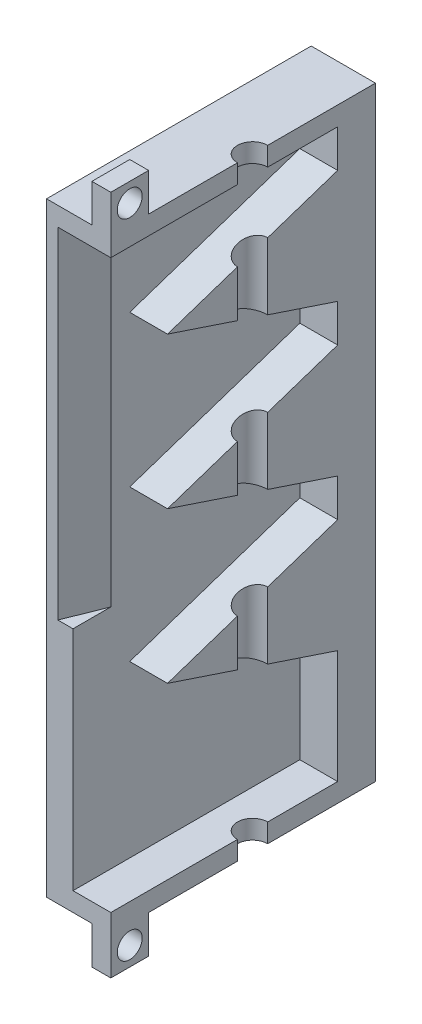
ISO-10303-21;
HEADER;
FILE_DESCRIPTION(('STEP AP214'),'2;1');
FILE_NAME('part.step','',(''),(''),'','','');
FILE_SCHEMA(('AUTOMOTIVE_DESIGN { 1 0 10303 214 1 1 1 1 }'));
ENDSEC;
DATA;
#1=APPLICATION_CONTEXT('core data for automotive mechanical design processes');
#2=APPLICATION_PROTOCOL_DEFINITION('international standard','automotive_design',2000,#1);
#3=PRODUCT_CONTEXT('',#1,'mechanical');
#4=PRODUCT('Part','Part','',(#3));
#5=PRODUCT_RELATED_PRODUCT_CATEGORY('part','',(#4));
#6=PRODUCT_DEFINITION_FORMATION('','',#4);
#7=PRODUCT_DEFINITION_CONTEXT('part definition',#1,'design');
#8=PRODUCT_DEFINITION('design','',#6,#7);
#9=PRODUCT_DEFINITION_SHAPE('','',#8);
#10=(LENGTH_UNIT() NAMED_UNIT(*) SI_UNIT(.MILLI.,.METRE.));
#11=(NAMED_UNIT(*) PLANE_ANGLE_UNIT() SI_UNIT($,.RADIAN.));
#12=(NAMED_UNIT(*) SI_UNIT($,.STERADIAN.) SOLID_ANGLE_UNIT());
#13=UNCERTAINTY_MEASURE_WITH_UNIT(LENGTH_MEASURE(1.E-05),#10,'distance_accuracy_value','');
#14=(GEOMETRIC_REPRESENTATION_CONTEXT(3) GLOBAL_UNCERTAINTY_ASSIGNED_CONTEXT((#13)) GLOBAL_UNIT_ASSIGNED_CONTEXT((#10,
#11,#12)) REPRESENTATION_CONTEXT('',''));
#15=CARTESIAN_POINT('',(0.,0.,0.));
#16=DIRECTION('',(0.,0.,1.));
#17=DIRECTION('',(1.,0.,0.));
#18=AXIS2_PLACEMENT_3D('',#15,#16,#17);
#19=CARTESIAN_POINT('',(8.5,0.,0.));
#20=DIRECTION('',(1.,0.,0.));
#21=DIRECTION('',(0.,0.,-1.));
#22=AXIS2_PLACEMENT_3D('',#19,#20,#21);
#23=PLANE('',#22);
#24=DIRECTION('',(0.,-0.316227766016838,0.948683298050514));
#25=VECTOR('',#24,1.);
#26=CARTESIAN_POINT('',(8.5,52.5,-30.));
#27=LINE('',#26,#25);
#28=CARTESIAN_POINT('',(8.5,48.0833333333333,-16.75));
#29=VERTEX_POINT('',#28);
#30=CARTESIAN_POINT('',(8.5,45.,-7.5));
#31=VERTEX_POINT('',#30);
#32=EDGE_CURVE('E437',#29,#31,#27,.T.);
#33=ORIENTED_EDGE('',*,*,#32,.T.);
#34=DIRECTION('',(0.,-0.316227766016838,-0.948683298050514));
#35=VECTOR('',#34,1.);
#36=CARTESIAN_POINT('',(8.5,45.,-7.5));
#37=LINE('',#36,#35);
#38=CARTESIAN_POINT('',(8.5,41.9166666666667,-16.75));
#39=VERTEX_POINT('',#38);
#40=EDGE_CURVE('E432',#31,#39,#37,.T.);
#41=ORIENTED_EDGE('',*,*,#40,.T.);
#42=DIRECTION('',(0.,-1.,0.));
#43=VECTOR('',#42,1.);
#44=CARTESIAN_POINT('',(8.5,85.6568542494924,-16.75));
#45=LINE('',#44,#43);
#46=EDGE_CURVE('E446',#39,#29,#45,.F.);
#47=ORIENTED_EDGE('',*,*,#46,.T.);
#48=EDGE_LOOP('',(#33,#41,#47));
#49=FACE_BOUND('',#48,.T.);
#50=ADVANCED_FACE('F35',(#49),#23,.T.);
#51=DIRECTION('',(0.,-0.316227766016838,0.948683298050514));
#52=VECTOR('',#51,1.);
#53=CARTESIAN_POINT('',(8.5,32.5,-30.));
#54=LINE('',#53,#52);
#55=CARTESIAN_POINT('',(8.5,28.0833333333333,-16.75));
#56=VERTEX_POINT('',#55);
#57=CARTESIAN_POINT('',(8.5,25.,-7.5));
#58=VERTEX_POINT('',#57);
#59=EDGE_CURVE('E429',#56,#58,#54,.T.);
#60=ORIENTED_EDGE('',*,*,#59,.T.);
#61=DIRECTION('',(0.,-0.316227766016838,-0.948683298050514));
#62=VECTOR('',#61,1.);
#63=CARTESIAN_POINT('',(8.5,25.,-7.5));
#64=LINE('',#63,#62);
#65=CARTESIAN_POINT('',(8.5,21.9166666666667,-16.75));
#66=VERTEX_POINT('',#65);
#67=EDGE_CURVE('E424',#58,#66,#64,.T.);
#68=ORIENTED_EDGE('',*,*,#67,.T.);
#69=DIRECTION('',(0.,-1.,0.));
#70=VECTOR('',#69,1.);
#71=CARTESIAN_POINT('',(8.5,85.6568542494924,-16.75));
#72=LINE('',#71,#70);
#73=EDGE_CURVE('E452',#66,#56,#72,.F.);
#74=ORIENTED_EDGE('',*,*,#73,.T.);
#75=EDGE_LOOP('',(#60,#68,#74));
#76=FACE_BOUND('',#75,.T.);
#77=ADVANCED_FACE('F664',(#76),#23,.T.);
#78=DIRECTION('',(0.,-0.316227766016838,0.948683298050514));
#79=VECTOR('',#78,1.);
#80=CARTESIAN_POINT('',(8.5,72.5,-30.));
#81=LINE('',#80,#79);
#82=CARTESIAN_POINT('',(8.5,68.0833333333333,-16.75));
#83=VERTEX_POINT('',#82);
#84=CARTESIAN_POINT('',(8.5,65.,-7.5));
#85=VERTEX_POINT('',#84);
#86=EDGE_CURVE('E421',#83,#85,#81,.T.);
#87=ORIENTED_EDGE('',*,*,#86,.T.);
#88=DIRECTION('',(0.,-0.316227766016838,-0.948683298050514));
#89=VECTOR('',#88,1.);
#90=CARTESIAN_POINT('',(8.5,65.,-7.5));
#91=LINE('',#90,#89);
#92=CARTESIAN_POINT('',(8.5,61.9166666666667,-16.75));
#93=VERTEX_POINT('',#92);
#94=EDGE_CURVE('E384',#85,#93,#91,.T.);
#95=ORIENTED_EDGE('',*,*,#94,.T.);
#96=DIRECTION('',(0.,-1.,0.));
#97=VECTOR('',#96,1.);
#98=CARTESIAN_POINT('',(8.5,85.6568542494924,-16.75));
#99=LINE('',#98,#97);
#100=EDGE_CURVE('E458',#93,#83,#99,.F.);
#101=ORIENTED_EDGE('',*,*,#100,.T.);
#102=EDGE_LOOP('',(#87,#95,#101));
#103=FACE_BOUND('',#102,.T.);
#104=ADVANCED_FACE('F620',(#103),#23,.T.);
#105=CARTESIAN_POINT('',(8.5,-2.5,-2.5));
#106=DIRECTION('',(1.,0.,0.));
#107=DIRECTION('',(0.,0.,-1.));
#108=AXIS2_PLACEMENT_3D('',#105,#106,#107);
#109=CIRCLE('',#108,1.65);
#110=CARTESIAN_POINT('',(8.5,-2.5,-4.15));
#111=VERTEX_POINT('',#110);
#112=EDGE_CURVE('E443',#111,#111,#109,.F.);
#113=ORIENTED_EDGE('',*,*,#112,.T.);
#114=EDGE_LOOP('',(#113));
#115=FACE_BOUND('',#114,.T.);
#116=DIRECTION('',(0.,0.,1.));
#117=VECTOR('',#116,1.);
#118=CARTESIAN_POINT('',(8.5,-5.,0.));
#119=LINE('',#118,#117);
#120=CARTESIAN_POINT('',(8.5,-5.,-5.));
#121=VERTEX_POINT('',#120);
#122=CARTESIAN_POINT('',(8.5,-5.,0.));
#123=VERTEX_POINT('',#122);
#124=EDGE_CURVE('E561',#121,#123,#119,.T.);
#125=ORIENTED_EDGE('',*,*,#124,.F.);
#126=DIRECTION('',(0.,1.,0.));
#127=VECTOR('',#126,1.);
#128=CARTESIAN_POINT('',(8.5,-5.,-5.));
#129=LINE('',#128,#127);
#130=CARTESIAN_POINT('',(8.5,0.,-5.));
#131=VERTEX_POINT('',#130);
#132=EDGE_CURVE('E440',#121,#131,#129,.T.);
#133=ORIENTED_EDGE('',*,*,#132,.T.);
#134=DIRECTION('',(0.,0.,1.));
#135=VECTOR('',#134,1.);
#136=CARTESIAN_POINT('',(8.5,0.,0.));
#137=LINE('',#136,#135);
#138=CARTESIAN_POINT('',(8.5,0.,-16.75));
#139=VERTEX_POINT('',#138);
#140=EDGE_CURVE('E408',#139,#131,#137,.T.);
#141=ORIENTED_EDGE('',*,*,#140,.F.);
#142=DIRECTION('',(0.,-1.,0.));
#143=VECTOR('',#142,1.);
#144=CARTESIAN_POINT('',(8.5,85.6568542494924,-16.75));
#145=LINE('',#144,#143);
#146=CARTESIAN_POINT('',(8.5,2.5,-16.75));
#147=VERTEX_POINT('',#146);
#148=EDGE_CURVE('E464',#139,#147,#145,.F.);
#149=ORIENTED_EDGE('',*,*,#148,.T.);
#150=DIRECTION('',(0.,0.,-1.));
#151=VECTOR('',#150,1.);
#152=CARTESIAN_POINT('',(8.5,2.5,-30.));
#153=LINE('',#152,#151);
#154=CARTESIAN_POINT('',(8.5,2.5,0.));
#155=VERTEX_POINT('',#154);
#156=EDGE_CURVE('E392',#155,#147,#153,.T.);
#157=ORIENTED_EDGE('',*,*,#156,.F.);
#158=DIRECTION('',(0.,-1.,0.));
#159=VECTOR('',#158,1.);
#160=CARTESIAN_POINT('',(8.5,80.,0.));
#161=LINE('',#160,#159);
#162=EDGE_CURVE('E412',#155,#123,#161,.T.);
#163=ORIENTED_EDGE('',*,*,#162,.T.);
#164=EDGE_LOOP('',(#125,#133,#141,#149,#157,#163));
#165=FACE_BOUND('',#164,.T.);
#166=ADVANCED_FACE('F583',(#115,#165),#23,.T.);
#167=DIRECTION('',(0.,-1.,0.));
#168=VECTOR('',#167,1.);
#169=CARTESIAN_POINT('',(8.5,85.,-5.));
#170=LINE('',#169,#168);
#171=CARTESIAN_POINT('',(8.5,85.,-5.));
#172=VERTEX_POINT('',#171);
#173=CARTESIAN_POINT('',(8.5,80.,-5.));
#174=VERTEX_POINT('',#173);
#175=EDGE_CURVE('E560',#172,#174,#170,.T.);
#176=ORIENTED_EDGE('',*,*,#175,.F.);
#177=DIRECTION('',(0.,0.,-1.));
#178=VECTOR('',#177,1.);
#179=CARTESIAN_POINT('',(8.5,85.,0.));
#180=LINE('',#179,#178);
#181=CARTESIAN_POINT('',(8.5,85.,0.));
#182=VERTEX_POINT('',#181);
#183=EDGE_CURVE('E558',#182,#172,#180,.T.);
#184=ORIENTED_EDGE('',*,*,#183,.F.);
#185=CARTESIAN_POINT('',(8.5,77.5,0.));
#186=VERTEX_POINT('',#185);
#187=EDGE_CURVE('E390',#182,#186,#161,.T.);
#188=ORIENTED_EDGE('',*,*,#187,.T.);
#189=DIRECTION('',(0.,0.,1.));
#190=VECTOR('',#189,1.);
#191=CARTESIAN_POINT('',(8.5,77.5,-30.));
#192=LINE('',#191,#190);
#193=CARTESIAN_POINT('',(8.5,77.5,-16.75));
#194=VERTEX_POINT('',#193);
#195=EDGE_CURVE('E288',#194,#186,#192,.T.);
#196=ORIENTED_EDGE('',*,*,#195,.F.);
#197=DIRECTION('',(0.,-1.,0.));
#198=VECTOR('',#197,1.);
#199=CARTESIAN_POINT('',(8.5,85.6568542494924,-16.75));
#200=LINE('',#199,#198);
#201=CARTESIAN_POINT('',(8.5,80.,-16.75));
#202=VERTEX_POINT('',#201);
#203=EDGE_CURVE('E274',#194,#202,#200,.F.);
#204=ORIENTED_EDGE('',*,*,#203,.T.);
#205=DIRECTION('',(0.,0.,1.));
#206=VECTOR('',#205,1.);
#207=CARTESIAN_POINT('',(8.5,80.,0.));
#208=LINE('',#207,#206);
#209=EDGE_CURVE('E379',#202,#174,#208,.T.);
#210=ORIENTED_EDGE('',*,*,#209,.T.);
#211=EDGE_LOOP('',(#176,#184,#188,#196,#204,#210));
#212=FACE_BOUND('',#211,.T.);
#213=CARTESIAN_POINT('',(8.5,82.5,-2.5));
#214=DIRECTION('',(1.,0.,0.));
#215=DIRECTION('',(0.,0.,-1.));
#216=AXIS2_PLACEMENT_3D('',#213,#214,#215);
#217=CIRCLE('',#216,1.65);
#218=CARTESIAN_POINT('',(8.5,82.5,-4.15));
#219=VERTEX_POINT('',#218);
#220=EDGE_CURVE('E493',#219,#219,#217,.T.);
#221=ORIENTED_EDGE('',*,*,#220,.F.);
#222=EDGE_LOOP('',(#221));
#223=FACE_BOUND('',#222,.T.);
#224=ADVANCED_FACE('F386',(#212,#223),#23,.T.);
#225=DIRECTION('',(0.,1.,0.));
#226=VECTOR('',#225,1.);
#227=CARTESIAN_POINT('',(8.5,77.5,-30.));
#228=LINE('',#227,#226);
#229=CARTESIAN_POINT('',(8.5,32.5,-30.));
#230=VERTEX_POINT('',#229);
#231=CARTESIAN_POINT('',(8.5,37.5,-30.));
#232=VERTEX_POINT('',#231);
#233=EDGE_CURVE('E405',#230,#232,#228,.T.);
#234=ORIENTED_EDGE('',*,*,#233,.F.);
#235=CARTESIAN_POINT('',(8.5,29.4166666666667,-20.75));
#236=VERTEX_POINT('',#235);
#237=EDGE_CURVE('E428',#230,#236,#54,.T.);
#238=ORIENTED_EDGE('',*,*,#237,.T.);
#239=DIRECTION('',(0.,-1.,0.));
#240=VECTOR('',#239,1.);
#241=CARTESIAN_POINT('',(8.5,85.6568542494924,-20.75));
#242=LINE('',#241,#240);
#243=CARTESIAN_POINT('',(8.5,20.5833333333333,-20.75));
#244=VERTEX_POINT('',#243);
#245=EDGE_CURVE('E455',#236,#244,#242,.T.);
#246=ORIENTED_EDGE('',*,*,#245,.T.);
#247=CARTESIAN_POINT('',(8.5,17.5,-30.));
#248=VERTEX_POINT('',#247);
#249=EDGE_CURVE('E425',#244,#248,#64,.T.);
#250=ORIENTED_EDGE('',*,*,#249,.T.);
#251=DIRECTION('',(0.,1.,0.));
#252=VECTOR('',#251,1.);
#253=CARTESIAN_POINT('',(8.5,77.5,-30.));
#254=LINE('',#253,#252);
#255=CARTESIAN_POINT('',(8.5,2.5,-30.));
#256=VERTEX_POINT('',#255);
#257=EDGE_CURVE('E399',#256,#248,#254,.T.);
#258=ORIENTED_EDGE('',*,*,#257,.F.);
#259=CARTESIAN_POINT('',(8.5,2.5,-20.75));
#260=VERTEX_POINT('',#259);
#261=EDGE_CURVE('E394',#260,#256,#153,.T.);
#262=ORIENTED_EDGE('',*,*,#261,.F.);
#263=DIRECTION('',(0.,-1.,0.));
#264=VECTOR('',#263,1.);
#265=CARTESIAN_POINT('',(8.5,85.6568542494924,-20.75));
#266=LINE('',#265,#264);
#267=CARTESIAN_POINT('',(8.5,0.,-20.75));
#268=VERTEX_POINT('',#267);
#269=EDGE_CURVE('E298',#260,#268,#266,.T.);
#270=ORIENTED_EDGE('',*,*,#269,.T.);
#271=CARTESIAN_POINT('',(8.5,0.,-35.));
#272=VERTEX_POINT('',#271);
#273=EDGE_CURVE('E409',#272,#268,#137,.T.);
#274=ORIENTED_EDGE('',*,*,#273,.F.);
#275=DIRECTION('',(0.,1.,0.));
#276=VECTOR('',#275,1.);
#277=CARTESIAN_POINT('',(8.5,80.,-35.));
#278=LINE('',#277,#276);
#279=CARTESIAN_POINT('',(8.5,80.,-35.));
#280=VERTEX_POINT('',#279);
#281=EDGE_CURVE('E415',#272,#280,#278,.T.);
#282=ORIENTED_EDGE('',*,*,#281,.T.);
#283=CARTESIAN_POINT('',(8.5,80.,-20.75));
#284=VERTEX_POINT('',#283);
#285=EDGE_CURVE('E296',#280,#284,#208,.T.);
#286=ORIENTED_EDGE('',*,*,#285,.T.);
#287=DIRECTION('',(0.,-1.,0.));
#288=VECTOR('',#287,1.);
#289=CARTESIAN_POINT('',(8.5,85.6568542494924,-20.75));
#290=LINE('',#289,#288);
#291=CARTESIAN_POINT('',(8.5,77.5,-20.75));
#292=VERTEX_POINT('',#291);
#293=EDGE_CURVE('E272',#284,#292,#290,.T.);
#294=ORIENTED_EDGE('',*,*,#293,.T.);
#295=CARTESIAN_POINT('',(8.5,77.5,-30.));
#296=VERTEX_POINT('',#295);
#297=EDGE_CURVE('E281',#296,#292,#192,.T.);
#298=ORIENTED_EDGE('',*,*,#297,.F.);
#299=DIRECTION('',(0.,1.,0.));
#300=VECTOR('',#299,1.);
#301=CARTESIAN_POINT('',(8.5,77.5,-30.));
#302=LINE('',#301,#300);
#303=CARTESIAN_POINT('',(8.5,72.5,-30.));
#304=VERTEX_POINT('',#303);
#305=EDGE_CURVE('E289',#304,#296,#302,.T.);
#306=ORIENTED_EDGE('',*,*,#305,.F.);
#307=CARTESIAN_POINT('',(8.5,69.4166666666667,-20.75));
#308=VERTEX_POINT('',#307);
#309=EDGE_CURVE('E420',#304,#308,#81,.T.);
#310=ORIENTED_EDGE('',*,*,#309,.T.);
#311=DIRECTION('',(0.,-1.,0.));
#312=VECTOR('',#311,1.);
#313=CARTESIAN_POINT('',(8.5,85.6568542494924,-20.75));
#314=LINE('',#313,#312);
#315=CARTESIAN_POINT('',(8.5,60.5833333333333,-20.75));
#316=VERTEX_POINT('',#315);
#317=EDGE_CURVE('E461',#308,#316,#314,.T.);
#318=ORIENTED_EDGE('',*,*,#317,.T.);
#319=CARTESIAN_POINT('',(8.5,57.5,-30.));
#320=VERTEX_POINT('',#319);
#321=EDGE_CURVE('E417',#316,#320,#91,.T.);
#322=ORIENTED_EDGE('',*,*,#321,.T.);
#323=DIRECTION('',(0.,1.,0.));
#324=VECTOR('',#323,1.);
#325=CARTESIAN_POINT('',(8.5,77.5,-30.));
#326=LINE('',#325,#324);
#327=CARTESIAN_POINT('',(8.5,52.5,-30.));
#328=VERTEX_POINT('',#327);
#329=EDGE_CURVE('E402',#328,#320,#326,.T.);
#330=ORIENTED_EDGE('',*,*,#329,.F.);
#331=CARTESIAN_POINT('',(8.5,49.4166666666667,-20.75));
#332=VERTEX_POINT('',#331);
#333=EDGE_CURVE('E436',#328,#332,#27,.T.);
#334=ORIENTED_EDGE('',*,*,#333,.T.);
#335=DIRECTION('',(0.,-1.,0.));
#336=VECTOR('',#335,1.);
#337=CARTESIAN_POINT('',(8.5,85.6568542494924,-20.75));
#338=LINE('',#337,#336);
#339=CARTESIAN_POINT('',(8.5,40.5833333333333,-20.75));
#340=VERTEX_POINT('',#339);
#341=EDGE_CURVE('E449',#332,#340,#338,.T.);
#342=ORIENTED_EDGE('',*,*,#341,.T.);
#343=EDGE_CURVE('E433',#340,#232,#37,.T.);
#344=ORIENTED_EDGE('',*,*,#343,.T.);
#345=EDGE_LOOP('',(#234,#238,#246,#250,#258,#262,#270,#274,#282,#286,#294,#298,#306,#310,#318,
#322,#330,#334,#342,#344));
#346=FACE_BOUND('',#345,.T.);
#347=ADVANCED_FACE('F293',(#346),#23,.T.);
#348=CARTESIAN_POINT('',(0.,80.,0.));
#349=DIRECTION('',(0.,0.,-1.));
#350=DIRECTION('',(-1.,0.,0.));
#351=AXIS2_PLACEMENT_3D('',#348,#349,#350);
#352=PLANE('',#351);
#353=ORIENTED_EDGE('',*,*,#187,.F.);
#354=DIRECTION('',(-1.,0.,0.));
#355=VECTOR('',#354,1.);
#356=CARTESIAN_POINT('',(6.,85.,0.));
#357=LINE('',#356,#355);
#358=CARTESIAN_POINT('',(6.,85.,0.));
#359=VERTEX_POINT('',#358);
#360=EDGE_CURVE('E357',#182,#359,#357,.T.);
#361=ORIENTED_EDGE('',*,*,#360,.T.);
#362=DIRECTION('',(0.,-1.,0.));
#363=VECTOR('',#362,1.);
#364=CARTESIAN_POINT('',(6.,85.,0.));
#365=LINE('',#364,#363);
#366=CARTESIAN_POINT('',(6.,80.,0.));
#367=VERTEX_POINT('',#366);
#368=EDGE_CURVE('E52',#359,#367,#365,.T.);
#369=ORIENTED_EDGE('',*,*,#368,.T.);
#370=DIRECTION('',(1.,0.,0.));
#371=VECTOR('',#370,1.);
#372=CARTESIAN_POINT('',(0.,80.,0.));
#373=LINE('',#372,#371);
#374=CARTESIAN_POINT('',(0.,80.,0.));
#375=VERTEX_POINT('',#374);
#376=EDGE_CURVE('E304',#375,#367,#373,.T.);
#377=ORIENTED_EDGE('',*,*,#376,.F.);
#378=DIRECTION('',(0.,-1.,0.));
#379=VECTOR('',#378,1.);
#380=CARTESIAN_POINT('',(0.,80.,0.));
#381=LINE('',#380,#379);
#382=CARTESIAN_POINT('',(0.,0.,0.));
#383=VERTEX_POINT('',#382);
#384=EDGE_CURVE('E490',#375,#383,#381,.T.);
#385=ORIENTED_EDGE('',*,*,#384,.T.);
#386=DIRECTION('',(1.,0.,0.));
#387=VECTOR('',#386,1.);
#388=CARTESIAN_POINT('',(0.,0.,0.));
#389=LINE('',#388,#387);
#390=CARTESIAN_POINT('',(6.,0.,0.));
#391=VERTEX_POINT('',#390);
#392=EDGE_CURVE('E311',#383,#391,#389,.T.);
#393=ORIENTED_EDGE('',*,*,#392,.T.);
#394=DIRECTION('',(0.,1.,0.));
#395=VECTOR('',#394,1.);
#396=CARTESIAN_POINT('',(6.,-5.,0.));
#397=LINE('',#396,#395);
#398=CARTESIAN_POINT('',(6.,-5.,0.));
#399=VERTEX_POINT('',#398);
#400=EDGE_CURVE('E349',#399,#391,#397,.T.);
#401=ORIENTED_EDGE('',*,*,#400,.F.);
#402=DIRECTION('',(-1.,0.,0.));
#403=VECTOR('',#402,1.);
#404=CARTESIAN_POINT('',(6.,-5.,0.));
#405=LINE('',#404,#403);
#406=EDGE_CURVE('E347',#123,#399,#405,.T.);
#407=ORIENTED_EDGE('',*,*,#406,.F.);
#408=ORIENTED_EDGE('',*,*,#162,.F.);
#409=DIRECTION('',(-1.,0.,0.));
#410=VECTOR('',#409,1.);
#411=CARTESIAN_POINT('',(15.5,2.5,0.));
#412=LINE('',#411,#410);
#413=CARTESIAN_POINT('',(3.5,2.5,0.));
#414=VERTEX_POINT('',#413);
#415=EDGE_CURVE('E318',#155,#414,#412,.T.);
#416=ORIENTED_EDGE('',*,*,#415,.T.);
#417=DIRECTION('',(0.,-1.,0.));
#418=VECTOR('',#417,1.);
#419=CARTESIAN_POINT('',(3.5,77.5,0.));
#420=LINE('',#419,#418);
#421=CARTESIAN_POINT('',(3.5,32.5,0.));
#422=VERTEX_POINT('',#421);
#423=EDGE_CURVE('E500',#422,#414,#420,.T.);
#424=ORIENTED_EDGE('',*,*,#423,.F.);
#425=DIRECTION('',(1.,0.,0.));
#426=VECTOR('',#425,1.);
#427=CARTESIAN_POINT('',(2.5,32.5,0.));
#428=LINE('',#427,#426);
#429=CARTESIAN_POINT('',(1.5,32.5,0.));
#430=VERTEX_POINT('',#429);
#431=EDGE_CURVE('E525',#430,#422,#428,.T.);
#432=ORIENTED_EDGE('',*,*,#431,.F.);
#433=DIRECTION('',(0.,-1.,0.));
#434=VECTOR('',#433,1.);
#435=CARTESIAN_POINT('',(1.5,35.,0.));
#436=LINE('',#435,#434);
#437=CARTESIAN_POINT('',(1.5,77.5,0.));
#438=VERTEX_POINT('',#437);
#439=EDGE_CURVE('E529',#438,#430,#436,.T.);
#440=ORIENTED_EDGE('',*,*,#439,.F.);
#441=DIRECTION('',(-1.,0.,0.));
#442=VECTOR('',#441,1.);
#443=CARTESIAN_POINT('',(15.5,77.5,0.));
#444=LINE('',#443,#442);
#445=EDGE_CURVE('E316',#186,#438,#444,.T.);
#446=ORIENTED_EDGE('',*,*,#445,.F.);
#447=EDGE_LOOP('',(#353,#361,#369,#377,#385,#393,#401,#407,#408,#416,#424,#432,#440,#446));
#448=FACE_BOUND('',#447,.T.);
#449=ADVANCED_FACE('F578',(#448),#352,.F.);
#450=CARTESIAN_POINT('',(0.,80.,-35.));
#451=DIRECTION('',(0.,0.,1.));
#452=DIRECTION('',(1.,0.,0.));
#453=AXIS2_PLACEMENT_3D('',#450,#451,#452);
#454=PLANE('',#453);
#455=ORIENTED_EDGE('',*,*,#281,.F.);
#456=DIRECTION('',(-1.,0.,0.));
#457=VECTOR('',#456,1.);
#458=CARTESIAN_POINT('',(0.,0.,-35.));
#459=LINE('',#458,#457);
#460=CARTESIAN_POINT('',(0.,0.,-35.));
#461=VERTEX_POINT('',#460);
#462=EDGE_CURVE('E309',#272,#461,#459,.T.);
#463=ORIENTED_EDGE('',*,*,#462,.T.);
#464=DIRECTION('',(0.,-1.,0.));
#465=VECTOR('',#464,1.);
#466=CARTESIAN_POINT('',(0.,80.,-35.));
#467=LINE('',#466,#465);
#468=CARTESIAN_POINT('',(0.,80.,-35.));
#469=VERTEX_POINT('',#468);
#470=EDGE_CURVE('E305',#469,#461,#467,.T.);
#471=ORIENTED_EDGE('',*,*,#470,.F.);
#472=DIRECTION('',(-1.,0.,0.));
#473=VECTOR('',#472,1.);
#474=CARTESIAN_POINT('',(0.,80.,-35.));
#475=LINE('',#474,#473);
#476=EDGE_CURVE('E302',#280,#469,#475,.T.);
#477=ORIENTED_EDGE('',*,*,#476,.F.);
#478=EDGE_LOOP('',(#455,#463,#471,#477));
#479=FACE_BOUND('',#478,.T.);
#480=ADVANCED_FACE('F484',(#479),#454,.F.);
#481=CARTESIAN_POINT('',(0.,80.,0.));
#482=DIRECTION('',(0.,-1.,0.));
#483=DIRECTION('',(0.,0.,-1.));
#484=AXIS2_PLACEMENT_3D('',#481,#482,#483);
#485=PLANE('',#484);
#486=ORIENTED_EDGE('',*,*,#285,.F.);
#487=ORIENTED_EDGE('',*,*,#476,.T.);
#488=DIRECTION('',(0.,0.,1.));
#489=VECTOR('',#488,1.);
#490=CARTESIAN_POINT('',(0.,80.,0.));
#491=LINE('',#490,#489);
#492=EDGE_CURVE('E308',#469,#375,#491,.T.);
#493=ORIENTED_EDGE('',*,*,#492,.T.);
#494=ORIENTED_EDGE('',*,*,#376,.T.);
#495=DIRECTION('',(0.,0.,-1.));
#496=VECTOR('',#495,1.);
#497=CARTESIAN_POINT('',(6.,80.,0.));
#498=LINE('',#497,#496);
#499=CARTESIAN_POINT('',(6.,80.,-5.));
#500=VERTEX_POINT('',#499);
#501=EDGE_CURVE('E362',#367,#500,#498,.T.);
#502=ORIENTED_EDGE('',*,*,#501,.T.);
#503=DIRECTION('',(1.,0.,0.));
#504=VECTOR('',#503,1.);
#505=CARTESIAN_POINT('',(6.,80.,-5.));
#506=LINE('',#505,#504);
#507=EDGE_CURVE('E360',#500,#174,#506,.T.);
#508=ORIENTED_EDGE('',*,*,#507,.T.);
#509=ORIENTED_EDGE('',*,*,#209,.F.);
#510=CARTESIAN_POINT('',(8.5,80.,-18.75));
#511=DIRECTION('',(0.,-1.,0.));
#512=DIRECTION('',(0.,0.,-1.));
#513=AXIS2_PLACEMENT_3D('',#510,#511,#512);
#514=CIRCLE('',#513,2.);
#515=EDGE_CURVE('E44',#284,#202,#514,.F.);
#516=ORIENTED_EDGE('',*,*,#515,.F.);
#517=EDGE_LOOP('',(#486,#487,#493,#494,#502,#508,#509,#516));
#518=FACE_BOUND('',#517,.T.);
#519=ADVANCED_FACE('F380',(#518),#485,.F.);
#520=CARTESIAN_POINT('',(0.,0.,0.));
#521=DIRECTION('',(0.,-1.,0.));
#522=DIRECTION('',(0.,0.,-1.));
#523=AXIS2_PLACEMENT_3D('',#520,#521,#522);
#524=PLANE('',#523);
#525=ORIENTED_EDGE('',*,*,#462,.F.);
#526=ORIENTED_EDGE('',*,*,#273,.T.);
#527=CARTESIAN_POINT('',(8.5,0.,-18.75));
#528=DIRECTION('',(0.,-1.,0.));
#529=DIRECTION('',(0.,0.,-1.));
#530=AXIS2_PLACEMENT_3D('',#527,#528,#529);
#531=CIRCLE('',#530,2.);
#532=EDGE_CURVE('E11',#139,#268,#531,.T.);
#533=ORIENTED_EDGE('',*,*,#532,.F.);
#534=ORIENTED_EDGE('',*,*,#140,.T.);
#535=DIRECTION('',(1.,0.,0.));
#536=VECTOR('',#535,1.);
#537=CARTESIAN_POINT('',(6.,0.,-5.));
#538=LINE('',#537,#536);
#539=CARTESIAN_POINT('',(6.,0.,-5.));
#540=VERTEX_POINT('',#539);
#541=EDGE_CURVE('E352',#540,#131,#538,.T.);
#542=ORIENTED_EDGE('',*,*,#541,.F.);
#543=DIRECTION('',(0.,0.,-1.));
#544=VECTOR('',#543,1.);
#545=CARTESIAN_POINT('',(6.,0.,0.));
#546=LINE('',#545,#544);
#547=EDGE_CURVE('E354',#391,#540,#546,.T.);
#548=ORIENTED_EDGE('',*,*,#547,.F.);
#549=ORIENTED_EDGE('',*,*,#392,.F.);
#550=DIRECTION('',(0.,0.,1.));
#551=VECTOR('',#550,1.);
#552=CARTESIAN_POINT('',(0.,0.,0.));
#553=LINE('',#552,#551);
#554=EDGE_CURVE('E314',#461,#383,#553,.T.);
#555=ORIENTED_EDGE('',*,*,#554,.F.);
#556=EDGE_LOOP('',(#525,#526,#533,#534,#542,#548,#549,#555));
#557=FACE_BOUND('',#556,.T.);
#558=ADVANCED_FACE('F478',(#557),#524,.T.);
#559=CARTESIAN_POINT('',(15.5,77.5,-30.));
#560=DIRECTION('',(0.,0.,1.));
#561=DIRECTION('',(0.,-1.,0.));
#562=AXIS2_PLACEMENT_3D('',#559,#560,#561);
#563=PLANE('',#562);
#564=DIRECTION('',(-1.,0.,0.));
#565=VECTOR('',#564,1.);
#566=CARTESIAN_POINT('',(42.5416345659799,32.5,-30.));
#567=LINE('',#566,#565);
#568=CARTESIAN_POINT('',(3.5,32.5,-30.));
#569=VERTEX_POINT('',#568);
#570=EDGE_CURVE('E339',#230,#569,#567,.T.);
#571=ORIENTED_EDGE('',*,*,#570,.F.);
#572=ORIENTED_EDGE('',*,*,#233,.T.);
#573=DIRECTION('',(-1.,0.,0.));
#574=VECTOR('',#573,1.);
#575=CARTESIAN_POINT('',(42.5416345659799,37.5,-30.));
#576=LINE('',#575,#574);
#577=CARTESIAN_POINT('',(3.5,37.5,-30.));
#578=VERTEX_POINT('',#577);
#579=EDGE_CURVE('E336',#232,#578,#576,.T.);
#580=ORIENTED_EDGE('',*,*,#579,.T.);
#581=DIRECTION('',(0.,1.,0.));
#582=VECTOR('',#581,1.);
#583=CARTESIAN_POINT('',(3.5,77.5,-30.));
#584=LINE('',#583,#582);
#585=EDGE_CURVE('E509',#569,#578,#584,.T.);
#586=ORIENTED_EDGE('',*,*,#585,.F.);
#587=EDGE_LOOP('',(#571,#572,#580,#586));
#588=FACE_BOUND('',#587,.T.);
#589=ADVANCED_FACE('F629',(#588),#563,.T.);
#590=DIRECTION('',(-1.,0.,0.));
#591=VECTOR('',#590,1.);
#592=CARTESIAN_POINT('',(42.5416345659799,52.5,-30.));
#593=LINE('',#592,#591);
#594=CARTESIAN_POINT('',(3.5,52.5,-30.));
#595=VERTEX_POINT('',#594);
#596=EDGE_CURVE('E331',#328,#595,#593,.T.);
#597=ORIENTED_EDGE('',*,*,#596,.F.);
#598=ORIENTED_EDGE('',*,*,#329,.T.);
#599=DIRECTION('',(-1.,0.,0.));
#600=VECTOR('',#599,1.);
#601=CARTESIAN_POINT('',(42.5416345659799,57.5,-30.));
#602=LINE('',#601,#600);
#603=CARTESIAN_POINT('',(3.5,57.5,-30.));
#604=VERTEX_POINT('',#603);
#605=EDGE_CURVE('E328',#320,#604,#602,.T.);
#606=ORIENTED_EDGE('',*,*,#605,.T.);
#607=EDGE_CURVE('E510',#595,#604,#584,.T.);
#608=ORIENTED_EDGE('',*,*,#607,.F.);
#609=EDGE_LOOP('',(#597,#598,#606,#608));
#610=FACE_BOUND('',#609,.T.);
#611=ADVANCED_FACE('F660',(#610),#563,.T.);
#612=DIRECTION('',(-1.,0.,0.));
#613=VECTOR('',#612,1.);
#614=CARTESIAN_POINT('',(15.5,2.5,-30.));
#615=LINE('',#614,#613);
#616=CARTESIAN_POINT('',(3.5,2.5,-30.));
#617=VERTEX_POINT('',#616);
#618=EDGE_CURVE('E320',#256,#617,#615,.T.);
#619=ORIENTED_EDGE('',*,*,#618,.F.);
#620=ORIENTED_EDGE('',*,*,#257,.T.);
#621=DIRECTION('',(-1.,0.,0.));
#622=VECTOR('',#621,1.);
#623=CARTESIAN_POINT('',(42.5416345659799,17.5,-30.));
#624=LINE('',#623,#622);
#625=CARTESIAN_POINT('',(3.5,17.5,-30.));
#626=VERTEX_POINT('',#625);
#627=EDGE_CURVE('E344',#248,#626,#624,.T.);
#628=ORIENTED_EDGE('',*,*,#627,.T.);
#629=EDGE_CURVE('E506',#617,#626,#584,.T.);
#630=ORIENTED_EDGE('',*,*,#629,.F.);
#631=EDGE_LOOP('',(#619,#620,#628,#630));
#632=FACE_BOUND('',#631,.T.);
#633=ADVANCED_FACE('F571',(#632),#563,.T.);
#634=DIRECTION('',(-1.,0.,0.));
#635=VECTOR('',#634,1.);
#636=CARTESIAN_POINT('',(42.5416345659799,72.5,-30.));
#637=LINE('',#636,#635);
#638=CARTESIAN_POINT('',(3.5,72.5,-30.));
#639=VERTEX_POINT('',#638);
#640=EDGE_CURVE('E323',#304,#639,#637,.T.);
#641=ORIENTED_EDGE('',*,*,#640,.F.);
#642=ORIENTED_EDGE('',*,*,#305,.T.);
#643=DIRECTION('',(-1.,0.,0.));
#644=VECTOR('',#643,1.);
#645=CARTESIAN_POINT('',(15.5,77.5,-30.));
#646=LINE('',#645,#644);
#647=CARTESIAN_POINT('',(3.5,77.5,-30.));
#648=VERTEX_POINT('',#647);
#649=EDGE_CURVE('E284',#296,#648,#646,.T.);
#650=ORIENTED_EDGE('',*,*,#649,.T.);
#651=EDGE_CURVE('E326',#639,#648,#584,.T.);
#652=ORIENTED_EDGE('',*,*,#651,.F.);
#653=EDGE_LOOP('',(#641,#642,#650,#652));
#654=FACE_BOUND('',#653,.T.);
#655=ADVANCED_FACE('F624',(#654),#563,.T.);
#656=CARTESIAN_POINT('',(15.5,77.5,-30.));
#657=DIRECTION('',(0.,-1.,0.));
#658=DIRECTION('',(0.,0.,-1.));
#659=AXIS2_PLACEMENT_3D('',#656,#657,#658);
#660=PLANE('',#659);
#661=ORIENTED_EDGE('',*,*,#649,.F.);
#662=ORIENTED_EDGE('',*,*,#297,.T.);
#663=CARTESIAN_POINT('',(8.5,77.5,-18.75));
#664=DIRECTION('',(0.,-1.,0.));
#665=DIRECTION('',(0.,0.,-1.));
#666=AXIS2_PLACEMENT_3D('',#663,#664,#665);
#667=CIRCLE('',#666,2.);
#668=EDGE_CURVE('E268',#194,#292,#667,.T.);
#669=ORIENTED_EDGE('',*,*,#668,.F.);
#670=ORIENTED_EDGE('',*,*,#195,.T.);
#671=ORIENTED_EDGE('',*,*,#445,.T.);
#672=DIRECTION('',(-0.371390676354103,0.,0.928476690885259));
#673=VECTOR('',#672,1.);
#674=CARTESIAN_POINT('',(2.5,77.5,-2.5));
#675=LINE('',#674,#673);
#676=CARTESIAN_POINT('',(3.5,77.5,-5.));
#677=VERTEX_POINT('',#676);
#678=EDGE_CURVE('E528',#677,#438,#675,.T.);
#679=ORIENTED_EDGE('',*,*,#678,.F.);
#680=DIRECTION('',(0.,0.,1.));
#681=VECTOR('',#680,1.);
#682=CARTESIAN_POINT('',(3.5,77.5,-30.));
#683=LINE('',#682,#681);
#684=EDGE_CURVE('E503',#648,#677,#683,.T.);
#685=ORIENTED_EDGE('',*,*,#684,.F.);
#686=EDGE_LOOP('',(#661,#662,#669,#670,#671,#679,#685));
#687=FACE_BOUND('',#686,.T.);
#688=ADVANCED_FACE('F282',(#687),#660,.T.);
#689=CARTESIAN_POINT('',(15.5,2.5,-30.));
#690=DIRECTION('',(0.,1.,0.));
#691=DIRECTION('',(0.,0.,1.));
#692=AXIS2_PLACEMENT_3D('',#689,#690,#691);
#693=PLANE('',#692);
#694=ORIENTED_EDGE('',*,*,#415,.F.);
#695=ORIENTED_EDGE('',*,*,#156,.T.);
#696=CARTESIAN_POINT('',(8.5,2.5,-18.75));
#697=DIRECTION('',(0.,1.,0.));
#698=DIRECTION('',(0.,0.,1.));
#699=AXIS2_PLACEMENT_3D('',#696,#697,#698);
#700=CIRCLE('',#699,2.);
#701=EDGE_CURVE('E277',#260,#147,#700,.T.);
#702=ORIENTED_EDGE('',*,*,#701,.F.);
#703=ORIENTED_EDGE('',*,*,#261,.T.);
#704=ORIENTED_EDGE('',*,*,#618,.T.);
#705=DIRECTION('',(0.,0.,-1.));
#706=VECTOR('',#705,1.);
#707=CARTESIAN_POINT('',(3.5,2.5,-30.));
#708=LINE('',#707,#706);
#709=EDGE_CURVE('E322',#414,#617,#708,.T.);
#710=ORIENTED_EDGE('',*,*,#709,.F.);
#711=EDGE_LOOP('',(#694,#695,#702,#703,#704,#710));
#712=FACE_BOUND('',#711,.T.);
#713=ADVANCED_FACE('F565',(#712),#693,.T.);
#714=CARTESIAN_POINT('',(42.5416345659799,65.,-7.5));
#715=DIRECTION('',(0.,0.948683298050514,-0.316227766016838));
#716=DIRECTION('',(0.,0.316227766016838,0.948683298050514));
#717=AXIS2_PLACEMENT_3D('',#714,#715,#716);
#718=PLANE('',#717);
#719=ORIENTED_EDGE('',*,*,#94,.F.);
#720=DIRECTION('',(-1.,0.,0.));
#721=VECTOR('',#720,1.);
#722=CARTESIAN_POINT('',(42.5416345659799,65.,-7.5));
#723=LINE('',#722,#721);
#724=CARTESIAN_POINT('',(3.5,65.,-7.5));
#725=VERTEX_POINT('',#724);
#726=EDGE_CURVE('E325',#85,#725,#723,.T.);
#727=ORIENTED_EDGE('',*,*,#726,.T.);
#728=DIRECTION('',(0.,-0.316227766016838,-0.948683298050514));
#729=VECTOR('',#728,1.);
#730=CARTESIAN_POINT('',(3.5,65.,-7.5));
#731=LINE('',#730,#729);
#732=EDGE_CURVE('E330',#725,#604,#731,.T.);
#733=ORIENTED_EDGE('',*,*,#732,.T.);
#734=ORIENTED_EDGE('',*,*,#605,.F.);
#735=ORIENTED_EDGE('',*,*,#321,.F.);
#736=CARTESIAN_POINT('',(8.5,61.25,-18.75));
#737=DIRECTION('',(0.,0.948683298050514,-0.316227766016838));
#738=DIRECTION('',(0.,-0.316227766016838,-0.948683298050514));
#739=AXIS2_PLACEMENT_3D('',#736,#737,#738);
#740=ELLIPSE('',#739,2.10818510677892,2.);
#741=EDGE_CURVE('E365',#316,#93,#740,.T.);
#742=ORIENTED_EDGE('',*,*,#741,.T.);
#743=EDGE_LOOP('',(#719,#727,#733,#734,#735,#742));
#744=FACE_BOUND('',#743,.T.);
#745=ADVANCED_FACE('F632',(#744),#718,.F.);
#746=CARTESIAN_POINT('',(42.5416345659799,72.5,-30.));
#747=DIRECTION('',(0.,-0.948683298050514,-0.316227766016838));
#748=DIRECTION('',(0.,0.316227766016838,-0.948683298050514));
#749=AXIS2_PLACEMENT_3D('',#746,#747,#748);
#750=PLANE('',#749);
#751=ORIENTED_EDGE('',*,*,#309,.F.);
#752=ORIENTED_EDGE('',*,*,#640,.T.);
#753=DIRECTION('',(0.,-0.316227766016838,0.948683298050514));
#754=VECTOR('',#753,1.);
#755=CARTESIAN_POINT('',(3.5,72.5,-30.));
#756=LINE('',#755,#754);
#757=EDGE_CURVE('E334',#639,#725,#756,.T.);
#758=ORIENTED_EDGE('',*,*,#757,.T.);
#759=ORIENTED_EDGE('',*,*,#726,.F.);
#760=ORIENTED_EDGE('',*,*,#86,.F.);
#761=CARTESIAN_POINT('',(8.5,68.75,-18.75));
#762=DIRECTION('',(0.,-0.948683298050514,-0.316227766016838));
#763=DIRECTION('',(0.,-0.316227766016838,0.948683298050514));
#764=AXIS2_PLACEMENT_3D('',#761,#762,#763);
#765=ELLIPSE('',#764,2.10818510677892,2.);
#766=EDGE_CURVE('E367',#83,#308,#765,.T.);
#767=ORIENTED_EDGE('',*,*,#766,.T.);
#768=EDGE_LOOP('',(#751,#752,#758,#759,#760,#767));
#769=FACE_BOUND('',#768,.T.);
#770=ADVANCED_FACE('F635',(#769),#750,.F.);
#771=CARTESIAN_POINT('',(42.5416345659799,25.,-7.5));
#772=DIRECTION('',(0.,0.948683298050514,-0.316227766016838));
#773=DIRECTION('',(0.,0.316227766016838,0.948683298050514));
#774=AXIS2_PLACEMENT_3D('',#771,#772,#773);
#775=PLANE('',#774);
#776=ORIENTED_EDGE('',*,*,#67,.F.);
#777=DIRECTION('',(-1.,0.,0.));
#778=VECTOR('',#777,1.);
#779=CARTESIAN_POINT('',(42.5416345659799,25.,-7.5));
#780=LINE('',#779,#778);
#781=CARTESIAN_POINT('',(3.5,25.,-7.5));
#782=VERTEX_POINT('',#781);
#783=EDGE_CURVE('E341',#58,#782,#780,.T.);
#784=ORIENTED_EDGE('',*,*,#783,.T.);
#785=DIRECTION('',(0.,-0.316227766016838,-0.948683298050514));
#786=VECTOR('',#785,1.);
#787=CARTESIAN_POINT('',(3.5,25.,-7.5));
#788=LINE('',#787,#786);
#789=EDGE_CURVE('E346',#782,#626,#788,.T.);
#790=ORIENTED_EDGE('',*,*,#789,.T.);
#791=ORIENTED_EDGE('',*,*,#627,.F.);
#792=ORIENTED_EDGE('',*,*,#249,.F.);
#793=CARTESIAN_POINT('',(8.5,21.25,-18.75));
#794=DIRECTION('',(0.,0.948683298050514,-0.316227766016838));
#795=DIRECTION('',(0.,-0.316227766016838,-0.948683298050514));
#796=AXIS2_PLACEMENT_3D('',#793,#794,#795);
#797=ELLIPSE('',#796,2.10818510677892,2.);
#798=EDGE_CURVE('E369',#244,#66,#797,.T.);
#799=ORIENTED_EDGE('',*,*,#798,.T.);
#800=EDGE_LOOP('',(#776,#784,#790,#791,#792,#799));
#801=FACE_BOUND('',#800,.T.);
#802=ADVANCED_FACE('F639',(#801),#775,.F.);
#803=CARTESIAN_POINT('',(42.5416345659799,32.5,-30.));
#804=DIRECTION('',(0.,-0.948683298050514,-0.316227766016838));
#805=DIRECTION('',(0.,0.316227766016838,-0.948683298050514));
#806=AXIS2_PLACEMENT_3D('',#803,#804,#805);
#807=PLANE('',#806);
#808=ORIENTED_EDGE('',*,*,#237,.F.);
#809=ORIENTED_EDGE('',*,*,#570,.T.);
#810=DIRECTION('',(0.,-0.316227766016838,0.948683298050514));
#811=VECTOR('',#810,1.);
#812=CARTESIAN_POINT('',(3.5,32.5,-30.));
#813=LINE('',#812,#811);
#814=EDGE_CURVE('E517',#569,#782,#813,.T.);
#815=ORIENTED_EDGE('',*,*,#814,.T.);
#816=ORIENTED_EDGE('',*,*,#783,.F.);
#817=ORIENTED_EDGE('',*,*,#59,.F.);
#818=CARTESIAN_POINT('',(8.5,28.75,-18.75));
#819=DIRECTION('',(0.,-0.948683298050514,-0.316227766016838));
#820=DIRECTION('',(0.,-0.316227766016838,0.948683298050514));
#821=AXIS2_PLACEMENT_3D('',#818,#819,#820);
#822=ELLIPSE('',#821,2.10818510677892,2.);
#823=EDGE_CURVE('E371',#56,#236,#822,.T.);
#824=ORIENTED_EDGE('',*,*,#823,.T.);
#825=EDGE_LOOP('',(#808,#809,#815,#816,#817,#824));
#826=FACE_BOUND('',#825,.T.);
#827=ADVANCED_FACE('F643',(#826),#807,.F.);
#828=CARTESIAN_POINT('',(42.5416345659799,45.,-7.5));
#829=DIRECTION('',(0.,0.948683298050514,-0.316227766016838));
#830=DIRECTION('',(0.,0.316227766016838,0.948683298050514));
#831=AXIS2_PLACEMENT_3D('',#828,#829,#830);
#832=PLANE('',#831);
#833=ORIENTED_EDGE('',*,*,#40,.F.);
#834=DIRECTION('',(-1.,0.,0.));
#835=VECTOR('',#834,1.);
#836=CARTESIAN_POINT('',(42.5416345659799,45.,-7.5));
#837=LINE('',#836,#835);
#838=CARTESIAN_POINT('',(3.5,45.,-7.5));
#839=VERTEX_POINT('',#838);
#840=EDGE_CURVE('E333',#31,#839,#837,.T.);
#841=ORIENTED_EDGE('',*,*,#840,.T.);
#842=DIRECTION('',(0.,-0.316227766016838,-0.948683298050514));
#843=VECTOR('',#842,1.);
#844=CARTESIAN_POINT('',(3.5,45.,-7.5));
#845=LINE('',#844,#843);
#846=EDGE_CURVE('E338',#839,#578,#845,.T.);
#847=ORIENTED_EDGE('',*,*,#846,.T.);
#848=ORIENTED_EDGE('',*,*,#579,.F.);
#849=ORIENTED_EDGE('',*,*,#343,.F.);
#850=CARTESIAN_POINT('',(8.5,41.25,-18.75));
#851=DIRECTION('',(0.,0.948683298050514,-0.316227766016838));
#852=DIRECTION('',(0.,-0.316227766016838,-0.948683298050514));
#853=AXIS2_PLACEMENT_3D('',#850,#851,#852);
#854=ELLIPSE('',#853,2.10818510677892,2.);
#855=EDGE_CURVE('E373',#340,#39,#854,.T.);
#856=ORIENTED_EDGE('',*,*,#855,.T.);
#857=EDGE_LOOP('',(#833,#841,#847,#848,#849,#856));
#858=FACE_BOUND('',#857,.T.);
#859=ADVANCED_FACE('F647',(#858),#832,.F.);
#860=CARTESIAN_POINT('',(42.5416345659799,52.5,-30.));
#861=DIRECTION('',(0.,-0.948683298050514,-0.316227766016838));
#862=DIRECTION('',(0.,0.316227766016838,-0.948683298050514));
#863=AXIS2_PLACEMENT_3D('',#860,#861,#862);
#864=PLANE('',#863);
#865=ORIENTED_EDGE('',*,*,#333,.F.);
#866=ORIENTED_EDGE('',*,*,#596,.T.);
#867=DIRECTION('',(0.,-0.316227766016838,0.948683298050514));
#868=VECTOR('',#867,1.);
#869=CARTESIAN_POINT('',(3.5,52.5,-30.));
#870=LINE('',#869,#868);
#871=EDGE_CURVE('E342',#595,#839,#870,.T.);
#872=ORIENTED_EDGE('',*,*,#871,.T.);
#873=ORIENTED_EDGE('',*,*,#840,.F.);
#874=ORIENTED_EDGE('',*,*,#32,.F.);
#875=CARTESIAN_POINT('',(8.5,48.75,-18.75));
#876=DIRECTION('',(0.,-0.948683298050514,-0.316227766016838));
#877=DIRECTION('',(0.,-0.316227766016838,0.948683298050514));
#878=AXIS2_PLACEMENT_3D('',#875,#876,#877);
#879=ELLIPSE('',#878,2.10818510677892,2.);
#880=EDGE_CURVE('E375',#29,#332,#879,.T.);
#881=ORIENTED_EDGE('',*,*,#880,.T.);
#882=EDGE_LOOP('',(#865,#866,#872,#873,#874,#881));
#883=FACE_BOUND('',#882,.T.);
#884=ADVANCED_FACE('F655',(#883),#864,.F.);
#885=CARTESIAN_POINT('',(6.,-5.,-5.));
#886=DIRECTION('',(0.,0.,1.));
#887=DIRECTION('',(1.,0.,0.));
#888=AXIS2_PLACEMENT_3D('',#885,#886,#887);
#889=PLANE('',#888);
#890=ORIENTED_EDGE('',*,*,#132,.F.);
#891=DIRECTION('',(1.,0.,0.));
#892=VECTOR('',#891,1.);
#893=CARTESIAN_POINT('',(6.,-5.,-5.));
#894=LINE('',#893,#892);
#895=CARTESIAN_POINT('',(6.,-5.,-5.));
#896=VERTEX_POINT('',#895);
#897=EDGE_CURVE('E71',#896,#121,#894,.T.);
#898=ORIENTED_EDGE('',*,*,#897,.F.);
#899=DIRECTION('',(0.,1.,0.));
#900=VECTOR('',#899,1.);
#901=CARTESIAN_POINT('',(6.,-5.,-5.));
#902=LINE('',#901,#900);
#903=EDGE_CURVE('E540',#896,#540,#902,.T.);
#904=ORIENTED_EDGE('',*,*,#903,.T.);
#905=ORIENTED_EDGE('',*,*,#541,.T.);
#906=EDGE_LOOP('',(#890,#898,#904,#905));
#907=FACE_BOUND('',#906,.T.);
#908=ADVANCED_FACE('F585',(#907),#889,.F.);
#909=CARTESIAN_POINT('',(0.,-5.,0.));
#910=DIRECTION('',(0.,-1.,0.));
#911=DIRECTION('',(0.,0.,-1.));
#912=AXIS2_PLACEMENT_3D('',#909,#910,#911);
#913=PLANE('',#912);
#914=ORIENTED_EDGE('',*,*,#897,.T.);
#915=ORIENTED_EDGE('',*,*,#124,.T.);
#916=ORIENTED_EDGE('',*,*,#406,.T.);
#917=DIRECTION('',(0.,0.,-1.));
#918=VECTOR('',#917,1.);
#919=CARTESIAN_POINT('',(6.,-5.,0.));
#920=LINE('',#919,#918);
#921=EDGE_CURVE('E351',#399,#896,#920,.T.);
#922=ORIENTED_EDGE('',*,*,#921,.T.);
#923=EDGE_LOOP('',(#914,#915,#916,#922));
#924=FACE_BOUND('',#923,.T.);
#925=ADVANCED_FACE('F37',(#924),#913,.T.);
#926=CARTESIAN_POINT('',(1.33309524416879,-2.5,-2.50000000000001));
#927=DIRECTION('',(1.,0.,0.));
#928=DIRECTION('',(0.,0.,-1.));
#929=AXIS2_PLACEMENT_3D('',#926,#927,#928);
#930=CYLINDRICAL_SURFACE('',#929,1.65);
#931=CARTESIAN_POINT('',(6.,-2.5,-2.5));
#932=DIRECTION('',(1.,0.,0.));
#933=DIRECTION('',(0.,0.,-1.));
#934=AXIS2_PLACEMENT_3D('',#931,#932,#933);
#935=CIRCLE('',#934,1.65);
#936=CARTESIAN_POINT('',(6.,-2.5,-4.15));
#937=VERTEX_POINT('',#936);
#938=EDGE_CURVE('E546',#937,#937,#935,.F.);
#939=ORIENTED_EDGE('',*,*,#938,.T.);
#940=EDGE_LOOP('',(#939));
#941=FACE_BOUND('',#940,.T.);
#942=ORIENTED_EDGE('',*,*,#112,.F.);
#943=EDGE_LOOP('',(#942));
#944=FACE_BOUND('',#943,.T.);
#945=ADVANCED_FACE('F608',(#941,#944),#930,.F.);
#946=CARTESIAN_POINT('',(6.,85.,-5.));
#947=DIRECTION('',(0.,0.,-1.));
#948=DIRECTION('',(-1.,0.,0.));
#949=AXIS2_PLACEMENT_3D('',#946,#947,#948);
#950=PLANE('',#949);
#951=DIRECTION('',(1.,0.,0.));
#952=VECTOR('',#951,1.);
#953=CARTESIAN_POINT('',(6.,85.,-5.));
#954=LINE('',#953,#952);
#955=CARTESIAN_POINT('',(6.,85.,-5.));
#956=VERTEX_POINT('',#955);
#957=EDGE_CURVE('E355',#956,#172,#954,.T.);
#958=ORIENTED_EDGE('',*,*,#957,.T.);
#959=ORIENTED_EDGE('',*,*,#175,.T.);
#960=ORIENTED_EDGE('',*,*,#507,.F.);
#961=DIRECTION('',(0.,-1.,0.));
#962=VECTOR('',#961,1.);
#963=CARTESIAN_POINT('',(6.,85.,-5.));
#964=LINE('',#963,#962);
#965=EDGE_CURVE('E63',#956,#500,#964,.T.);
#966=ORIENTED_EDGE('',*,*,#965,.F.);
#967=EDGE_LOOP('',(#958,#959,#960,#966));
#968=FACE_BOUND('',#967,.T.);
#969=ADVANCED_FACE('F593',(#968),#950,.T.);
#970=CARTESIAN_POINT('',(0.,85.,0.));
#971=DIRECTION('',(0.,1.,0.));
#972=DIRECTION('',(0.,0.,-1.));
#973=AXIS2_PLACEMENT_3D('',#970,#971,#972);
#974=PLANE('',#973);
#975=ORIENTED_EDGE('',*,*,#360,.F.);
#976=ORIENTED_EDGE('',*,*,#183,.T.);
#977=ORIENTED_EDGE('',*,*,#957,.F.);
#978=DIRECTION('',(0.,0.,-1.));
#979=VECTOR('',#978,1.);
#980=CARTESIAN_POINT('',(6.,85.,0.));
#981=LINE('',#980,#979);
#982=EDGE_CURVE('E359',#359,#956,#981,.T.);
#983=ORIENTED_EDGE('',*,*,#982,.F.);
#984=EDGE_LOOP('',(#975,#976,#977,#983));
#985=FACE_BOUND('',#984,.T.);
#986=ADVANCED_FACE('F597',(#985),#974,.T.);
#987=CARTESIAN_POINT('',(1.33309524416879,82.5,-2.50000000000001));
#988=DIRECTION('',(1.,0.,0.));
#989=DIRECTION('',(0.,0.,-1.));
#990=AXIS2_PLACEMENT_3D('',#987,#988,#989);
#991=CYLINDRICAL_SURFACE('',#990,1.65);
#992=CARTESIAN_POINT('',(6.,82.5,-2.5));
#993=DIRECTION('',(1.,0.,0.));
#994=DIRECTION('',(0.,0.,-1.));
#995=AXIS2_PLACEMENT_3D('',#992,#993,#994);
#996=CIRCLE('',#995,1.65);
#997=CARTESIAN_POINT('',(6.,82.5,-4.15));
#998=VERTEX_POINT('',#997);
#999=EDGE_CURVE('E278',#998,#998,#996,.T.);
#1000=ORIENTED_EDGE('',*,*,#999,.F.);
#1001=EDGE_LOOP('',(#1000));
#1002=FACE_BOUND('',#1001,.T.);
#1003=ORIENTED_EDGE('',*,*,#220,.T.);
#1004=EDGE_LOOP('',(#1003));
#1005=FACE_BOUND('',#1004,.T.);
#1006=ADVANCED_FACE('F599',(#1002,#1005),#991,.F.);
#1007=CARTESIAN_POINT('',(8.5,85.6568542494924,-18.75));
#1008=DIRECTION('',(0.,-1.,0.));
#1009=DIRECTION('',(0.,0.,-1.));
#1010=AXIS2_PLACEMENT_3D('',#1007,#1008,#1009);
#1011=CYLINDRICAL_SURFACE('',#1010,2.);
#1012=ORIENTED_EDGE('',*,*,#46,.F.);
#1013=ORIENTED_EDGE('',*,*,#855,.F.);
#1014=ORIENTED_EDGE('',*,*,#341,.F.);
#1015=ORIENTED_EDGE('',*,*,#880,.F.);
#1016=EDGE_LOOP('',(#1012,#1013,#1014,#1015));
#1017=FACE_BOUND('',#1016,.T.);
#1018=ADVANCED_FACE('F605',(#1017),#1011,.F.);
#1019=ORIENTED_EDGE('',*,*,#73,.F.);
#1020=ORIENTED_EDGE('',*,*,#798,.F.);
#1021=ORIENTED_EDGE('',*,*,#245,.F.);
#1022=ORIENTED_EDGE('',*,*,#823,.F.);
#1023=EDGE_LOOP('',(#1019,#1020,#1021,#1022));
#1024=FACE_BOUND('',#1023,.T.);
#1025=ADVANCED_FACE('F651',(#1024),#1011,.F.);
#1026=ORIENTED_EDGE('',*,*,#100,.F.);
#1027=ORIENTED_EDGE('',*,*,#741,.F.);
#1028=ORIENTED_EDGE('',*,*,#317,.F.);
#1029=ORIENTED_EDGE('',*,*,#766,.F.);
#1030=EDGE_LOOP('',(#1026,#1027,#1028,#1029));
#1031=FACE_BOUND('',#1030,.T.);
#1032=ADVANCED_FACE('F690',(#1031),#1011,.F.);
#1033=ORIENTED_EDGE('',*,*,#148,.F.);
#1034=ORIENTED_EDGE('',*,*,#532,.T.);
#1035=ORIENTED_EDGE('',*,*,#269,.F.);
#1036=ORIENTED_EDGE('',*,*,#701,.T.);
#1037=EDGE_LOOP('',(#1033,#1034,#1035,#1036));
#1038=FACE_BOUND('',#1037,.T.);
#1039=ADVANCED_FACE('F473',(#1038),#1011,.F.);
#1040=ORIENTED_EDGE('',*,*,#203,.F.);
#1041=ORIENTED_EDGE('',*,*,#668,.T.);
#1042=ORIENTED_EDGE('',*,*,#293,.F.);
#1043=ORIENTED_EDGE('',*,*,#515,.T.);
#1044=EDGE_LOOP('',(#1040,#1041,#1042,#1043));
#1045=FACE_BOUND('',#1044,.T.);
#1046=ADVANCED_FACE('F270',(#1045),#1011,.F.);
#1047=CARTESIAN_POINT('',(0.,80.,0.));
#1048=DIRECTION('',(1.,0.,0.));
#1049=DIRECTION('',(0.,0.,-1.));
#1050=AXIS2_PLACEMENT_3D('',#1047,#1048,#1049);
#1051=PLANE('',#1050);
#1052=ORIENTED_EDGE('',*,*,#554,.T.);
#1053=ORIENTED_EDGE('',*,*,#384,.F.);
#1054=ORIENTED_EDGE('',*,*,#492,.F.);
#1055=ORIENTED_EDGE('',*,*,#470,.T.);
#1056=EDGE_LOOP('',(#1052,#1053,#1054,#1055));
#1057=FACE_BOUND('',#1056,.T.);
#1058=ADVANCED_FACE('F487',(#1057),#1051,.F.);
#1059=CARTESIAN_POINT('',(3.5,77.5,-30.));
#1060=DIRECTION('',(-1.,0.,0.));
#1061=DIRECTION('',(0.,-1.,0.));
#1062=AXIS2_PLACEMENT_3D('',#1059,#1060,#1061);
#1063=PLANE('',#1062);
#1064=DIRECTION('',(0.,-1.,0.));
#1065=VECTOR('',#1064,1.);
#1066=CARTESIAN_POINT('',(3.5,35.,-5.));
#1067=LINE('',#1066,#1065);
#1068=CARTESIAN_POINT('',(3.5,32.5,-5.));
#1069=VERTEX_POINT('',#1068);
#1070=EDGE_CURVE('E520',#677,#1069,#1067,.T.);
#1071=ORIENTED_EDGE('',*,*,#1070,.T.);
#1072=DIRECTION('',(0.,0.,1.));
#1073=VECTOR('',#1072,1.);
#1074=CARTESIAN_POINT('',(3.5,32.5,-2.5));
#1075=LINE('',#1074,#1073);
#1076=EDGE_CURVE('E532',#1069,#422,#1075,.T.);
#1077=ORIENTED_EDGE('',*,*,#1076,.T.);
#1078=ORIENTED_EDGE('',*,*,#423,.T.);
#1079=ORIENTED_EDGE('',*,*,#709,.T.);
#1080=ORIENTED_EDGE('',*,*,#629,.T.);
#1081=ORIENTED_EDGE('',*,*,#789,.F.);
#1082=ORIENTED_EDGE('',*,*,#814,.F.);
#1083=ORIENTED_EDGE('',*,*,#585,.T.);
#1084=ORIENTED_EDGE('',*,*,#846,.F.);
#1085=ORIENTED_EDGE('',*,*,#871,.F.);
#1086=ORIENTED_EDGE('',*,*,#607,.T.);
#1087=ORIENTED_EDGE('',*,*,#732,.F.);
#1088=ORIENTED_EDGE('',*,*,#757,.F.);
#1089=ORIENTED_EDGE('',*,*,#651,.T.);
#1090=ORIENTED_EDGE('',*,*,#684,.T.);
#1091=EDGE_LOOP('',(#1071,#1077,#1078,#1079,#1080,#1081,#1082,#1083,#1084,#1085,#1086,#1087,
#1088,#1089,#1090));
#1092=FACE_BOUND('',#1091,.T.);
#1093=ADVANCED_FACE('F574',(#1092),#1063,.F.);
#1094=CARTESIAN_POINT('',(3.5,37.5,-5.));
#1095=DIRECTION('',(-0.928476690885259,0.,-0.371390676354104));
#1096=DIRECTION('',(0.,-1.,0.));
#1097=AXIS2_PLACEMENT_3D('',#1094,#1095,#1096);
#1098=PLANE('',#1097);
#1099=ORIENTED_EDGE('',*,*,#1070,.F.);
#1100=ORIENTED_EDGE('',*,*,#678,.T.);
#1101=ORIENTED_EDGE('',*,*,#439,.T.);
#1102=DIRECTION('',(-0.371390676354103,0.,0.928476690885259));
#1103=VECTOR('',#1102,1.);
#1104=CARTESIAN_POINT('',(2.5,32.5,-2.5));
#1105=LINE('',#1104,#1103);
#1106=EDGE_CURVE('E534',#1069,#430,#1105,.T.);
#1107=ORIENTED_EDGE('',*,*,#1106,.F.);
#1108=EDGE_LOOP('',(#1099,#1100,#1101,#1107));
#1109=FACE_BOUND('',#1108,.T.);
#1110=ADVANCED_FACE('F673',(#1109),#1098,.F.);
#1111=CARTESIAN_POINT('',(3.5,32.5,-5.));
#1112=DIRECTION('',(0.,-1.,0.));
#1113=DIRECTION('',(0.,0.,1.));
#1114=AXIS2_PLACEMENT_3D('',#1111,#1112,#1113);
#1115=PLANE('',#1114);
#1116=ORIENTED_EDGE('',*,*,#1076,.F.);
#1117=ORIENTED_EDGE('',*,*,#1106,.T.);
#1118=ORIENTED_EDGE('',*,*,#431,.T.);
#1119=EDGE_LOOP('',(#1116,#1117,#1118));
#1120=FACE_BOUND('',#1119,.T.);
#1121=ADVANCED_FACE('F671',(#1120),#1115,.F.);
#1122=CARTESIAN_POINT('',(6.,-5.,0.));
#1123=DIRECTION('',(1.,0.,0.));
#1124=DIRECTION('',(0.,0.,-1.));
#1125=AXIS2_PLACEMENT_3D('',#1122,#1123,#1124);
#1126=PLANE('',#1125);
#1127=ORIENTED_EDGE('',*,*,#938,.F.);
#1128=EDGE_LOOP('',(#1127));
#1129=FACE_BOUND('',#1128,.T.);
#1130=ORIENTED_EDGE('',*,*,#547,.T.);
#1131=ORIENTED_EDGE('',*,*,#903,.F.);
#1132=ORIENTED_EDGE('',*,*,#921,.F.);
#1133=ORIENTED_EDGE('',*,*,#400,.T.);
#1134=EDGE_LOOP('',(#1130,#1131,#1132,#1133));
#1135=FACE_BOUND('',#1134,.T.);
#1136=ADVANCED_FACE('F588',(#1129,#1135),#1126,.F.);
#1137=CARTESIAN_POINT('',(6.,85.,0.));
#1138=DIRECTION('',(-1.,0.,0.));
#1139=DIRECTION('',(0.,0.,1.));
#1140=AXIS2_PLACEMENT_3D('',#1137,#1138,#1139);
#1141=PLANE('',#1140);
#1142=ORIENTED_EDGE('',*,*,#999,.T.);
#1143=EDGE_LOOP('',(#1142));
#1144=FACE_BOUND('',#1143,.T.);
#1145=ORIENTED_EDGE('',*,*,#501,.F.);
#1146=ORIENTED_EDGE('',*,*,#368,.F.);
#1147=ORIENTED_EDGE('',*,*,#982,.T.);
#1148=ORIENTED_EDGE('',*,*,#965,.T.);
#1149=EDGE_LOOP('',(#1145,#1146,#1147,#1148));
#1150=FACE_BOUND('',#1149,.T.);
#1151=ADVANCED_FACE('F590',(#1144,#1150),#1141,.T.);
#1152=CLOSED_SHELL('',(#50,#77,#104,#166,#224,#347,#449,#480,#519,#558,#589,#611,#633,#655,#688,
#713,#745,#770,#802,#827,#859,#884,#908,#925,#945,#969,#986,#1006,#1018,#1025,#1032,#1039,#1046,
#1058,#1093,#1110,#1121,#1136,#1151));
#1153=MANIFOLD_SOLID_BREP('B2',#1152);
#1154=ADVANCED_BREP_SHAPE_REPRESENTATION('',(#18,#1153),#14);
#1155=SHAPE_DEFINITION_REPRESENTATION(#9,#1154);
ENDSEC;
END-ISO-10303-21;
